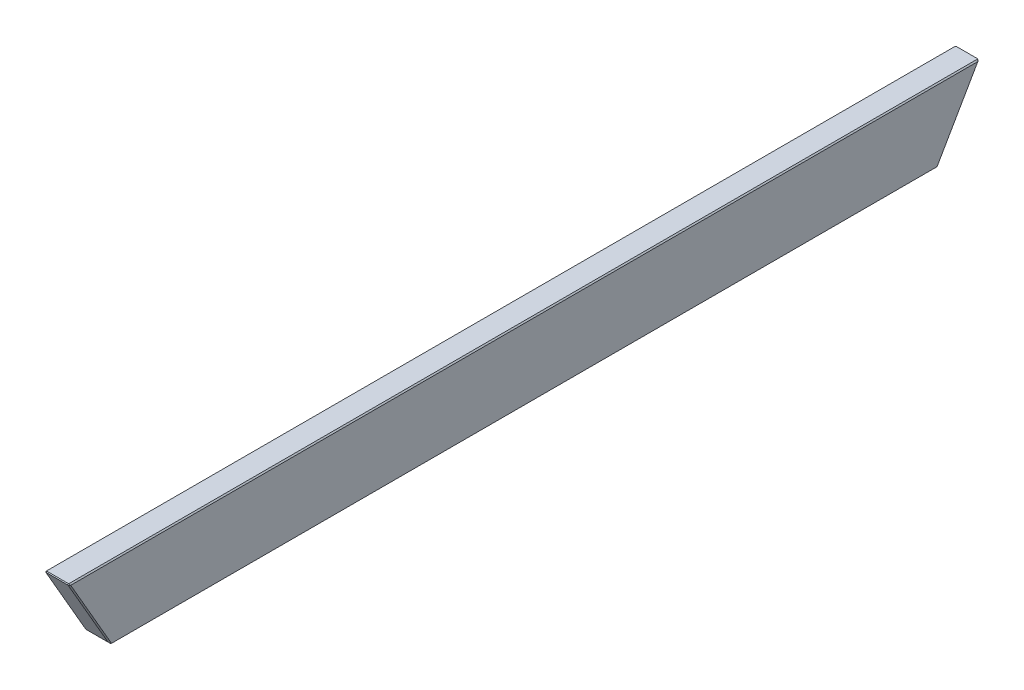
ISO-10303-21;
HEADER;
FILE_DESCRIPTION(('STEP AP214'),'2;1');
FILE_NAME('part.step','',(''),(''),'','','');
FILE_SCHEMA(('AUTOMOTIVE_DESIGN { 1 0 10303 214 1 1 1 1 }'));
ENDSEC;
DATA;
#1=APPLICATION_CONTEXT('core data for automotive mechanical design processes');
#2=APPLICATION_PROTOCOL_DEFINITION('international standard','automotive_design',2000,#1);
#3=PRODUCT_CONTEXT('',#1,'mechanical');
#4=PRODUCT('Part','Part','',(#3));
#5=PRODUCT_RELATED_PRODUCT_CATEGORY('part','',(#4));
#6=PRODUCT_DEFINITION_FORMATION('','',#4);
#7=PRODUCT_DEFINITION_CONTEXT('part definition',#1,'design');
#8=PRODUCT_DEFINITION('design','',#6,#7);
#9=PRODUCT_DEFINITION_SHAPE('','',#8);
#10=(LENGTH_UNIT() NAMED_UNIT(*) SI_UNIT(.MILLI.,.METRE.));
#11=(NAMED_UNIT(*) PLANE_ANGLE_UNIT() SI_UNIT($,.RADIAN.));
#12=(NAMED_UNIT(*) SI_UNIT($,.STERADIAN.) SOLID_ANGLE_UNIT());
#13=UNCERTAINTY_MEASURE_WITH_UNIT(LENGTH_MEASURE(1.E-05),#10,'distance_accuracy_value','');
#14=(GEOMETRIC_REPRESENTATION_CONTEXT(3) GLOBAL_UNCERTAINTY_ASSIGNED_CONTEXT((#13)) GLOBAL_UNIT_ASSIGNED_CONTEXT((#10,
#11,#12)) REPRESENTATION_CONTEXT('',''));
#15=CARTESIAN_POINT('',(0.,0.,0.));
#16=DIRECTION('',(0.,0.,1.));
#17=DIRECTION('',(1.,0.,0.));
#18=AXIS2_PLACEMENT_3D('',#15,#16,#17);
#19=CARTESIAN_POINT('',(1.05,-3.125,39.));
#20=DIRECTION('',(-1.,0.,0.));
#21=DIRECTION('',(0.,0.,1.));
#22=AXIS2_PLACEMENT_3D('',#19,#20,#21);
#23=PLANE('',#22);
#24=DIRECTION('',(0.,0.,-1.));
#25=VECTOR('',#24,1.);
#26=CARTESIAN_POINT('',(1.05,-3.02499999999999,39.));
#27=LINE('',#26,#25);
#28=CARTESIAN_POINT('',(1.05,-3.02499999999999,35.3338257906459));
#29=VERTEX_POINT('',#28);
#30=CARTESIAN_POINT('',(1.05,-3.02499999999999,-35.3338257906459));
#31=VERTEX_POINT('',#30);
#32=EDGE_CURVE('E342',#29,#31,#27,.T.);
#33=ORIENTED_EDGE('',*,*,#32,.T.);
#34=DIRECTION('',(0.,0.866025403784439,-0.5));
#35=VECTOR('',#34,1.);
#36=CARTESIAN_POINT('',(1.05,3.07499999999999,-38.8556624327026));
#37=LINE('',#36,#35);
#38=CARTESIAN_POINT('',(1.05,3.02499999999999,-38.8267949192431));
#39=VERTEX_POINT('',#38);
#40=EDGE_CURVE('E229',#31,#39,#37,.T.);
#41=ORIENTED_EDGE('',*,*,#40,.T.);
#42=DIRECTION('',(0.,0.,1.));
#43=VECTOR('',#42,1.);
#44=CARTESIAN_POINT('',(1.05,3.02499999999999,39.));
#45=LINE('',#44,#43);
#46=CARTESIAN_POINT('',(1.05,3.02499999999999,38.8267949192431));
#47=VERTEX_POINT('',#46);
#48=EDGE_CURVE('E335',#39,#47,#45,.T.);
#49=ORIENTED_EDGE('',*,*,#48,.T.);
#50=DIRECTION('',(0.,-0.866025403784439,-0.5));
#51=VECTOR('',#50,1.);
#52=CARTESIAN_POINT('',(1.05,-1.5125,36.2070680727952));
#53=LINE('',#52,#51);
#54=EDGE_CURVE('E227',#47,#29,#53,.T.);
#55=ORIENTED_EDGE('',*,*,#54,.T.);
#56=EDGE_LOOP('',(#33,#41,#49,#55));
#57=FACE_BOUND('',#56,.T.);
#58=ADVANCED_FACE('F36',(#57),#23,.F.);
#59=CARTESIAN_POINT('',(-1.05,3.125,39.));
#60=DIRECTION('',(0.,-1.,0.));
#61=DIRECTION('',(0.,0.,-1.));
#62=AXIS2_PLACEMENT_3D('',#59,#60,#61);
#63=PLANE('',#62);
#64=DIRECTION('',(0.,0.,-1.));
#65=VECTOR('',#64,1.);
#66=CARTESIAN_POINT('',(0.94999999999999,3.125,39.));
#67=LINE('',#66,#65);
#68=CARTESIAN_POINT('',(0.94999999999999,3.125,38.8919876550265));
#69=VERTEX_POINT('',#68);
#70=CARTESIAN_POINT('',(0.94999999999999,3.125,-38.8919876550265));
#71=VERTEX_POINT('',#70);
#72=EDGE_CURVE('E345',#69,#71,#67,.T.);
#73=ORIENTED_EDGE('',*,*,#72,.T.);
#74=DIRECTION('',(-0.688816127388591,0.,-0.724936095562487));
#75=VECTOR('',#74,1.);
#76=CARTESIAN_POINT('',(0.2271197285449,3.125,-39.6527741417404));
#77=LINE('',#76,#75);
#78=CARTESIAN_POINT('',(0.91692700902958,3.125,-38.9267949192431));
#79=VERTEX_POINT('',#78);
#80=EDGE_CURVE('E249',#71,#79,#77,.T.);
#81=ORIENTED_EDGE('',*,*,#80,.T.);
#82=DIRECTION('',(-1.,0.,0.));
#83=VECTOR('',#82,1.);
#84=CARTESIAN_POINT('',(-0.94999999999999,3.125,-38.9267949192431));
#85=LINE('',#84,#83);
#86=CARTESIAN_POINT('',(-0.916927009029587,3.125,-38.9267949192431));
#87=VERTEX_POINT('',#86);
#88=EDGE_CURVE('E247',#79,#87,#85,.T.);
#89=ORIENTED_EDGE('',*,*,#88,.T.);
#90=DIRECTION('',(-0.688816127388657,0.,0.724936095562425));
#91=VECTOR('',#90,1.);
#92=CARTESIAN_POINT('',(-0.913609282737055,3.125,-38.9302866196389));
#93=LINE('',#92,#91);
#94=CARTESIAN_POINT('',(-0.94999999999999,3.125,-38.8919876550265));
#95=VERTEX_POINT('',#94);
#96=EDGE_CURVE('E245',#87,#95,#93,.T.);
#97=ORIENTED_EDGE('',*,*,#96,.T.);
#98=DIRECTION('',(0.,0.,1.));
#99=VECTOR('',#98,1.);
#100=CARTESIAN_POINT('',(-0.94999999999999,3.125,39.));
#101=LINE('',#100,#99);
#102=CARTESIAN_POINT('',(-0.94999999999999,3.125,38.8919876550265));
#103=VERTEX_POINT('',#102);
#104=EDGE_CURVE('E207',#95,#103,#101,.T.);
#105=ORIENTED_EDGE('',*,*,#104,.T.);
#106=DIRECTION('',(0.688816127388628,0.,0.724936095562452));
#107=VECTOR('',#106,1.);
#108=CARTESIAN_POINT('',(-0.913609282737045,3.125,38.9302866196389));
#109=LINE('',#108,#107);
#110=CARTESIAN_POINT('',(-0.942386870415589,3.125,38.9));
#111=VERTEX_POINT('',#110);
#112=EDGE_CURVE('E243',#103,#111,#109,.T.);
#113=ORIENTED_EDGE('',*,*,#112,.T.);
#114=DIRECTION('',(1.,0.,0.));
#115=VECTOR('',#114,1.);
#116=CARTESIAN_POINT('',(-1.05,3.125,38.9));
#117=LINE('',#116,#115);
#118=CARTESIAN_POINT('',(0.942386870415594,3.125,38.9));
#119=VERTEX_POINT('',#118);
#120=EDGE_CURVE('E241',#111,#119,#117,.T.);
#121=ORIENTED_EDGE('',*,*,#120,.T.);
#122=DIRECTION('',(0.688816127388591,0.,-0.724936095562488));
#123=VECTOR('',#122,1.);
#124=CARTESIAN_POINT('',(0.227119728544901,3.125,39.6527741417404));
#125=LINE('',#124,#123);
#126=EDGE_CURVE('E239',#119,#69,#125,.T.);
#127=ORIENTED_EDGE('',*,*,#126,.T.);
#128=EDGE_LOOP('',(#73,#81,#89,#97,#105,#113,#121,#127));
#129=FACE_BOUND('',#128,.T.);
#130=ADVANCED_FACE('F418',(#129),#63,.F.);
#131=CARTESIAN_POINT('',(-1.05,-3.125,39.));
#132=DIRECTION('',(1.,0.,0.));
#133=DIRECTION('',(0.,0.,-1.));
#134=AXIS2_PLACEMENT_3D('',#131,#132,#133);
#135=PLANE('',#134);
#136=DIRECTION('',(0.,0.,-1.));
#137=VECTOR('',#136,1.);
#138=CARTESIAN_POINT('',(-1.05,3.02499999999999,39.));
#139=LINE('',#138,#137);
#140=CARTESIAN_POINT('',(-1.05,3.02499999999999,38.8267949192431));
#141=VERTEX_POINT('',#140);
#142=CARTESIAN_POINT('',(-1.05,3.02499999999999,-38.8267949192431));
#143=VERTEX_POINT('',#142);
#144=EDGE_CURVE('E348',#141,#143,#139,.T.);
#145=ORIENTED_EDGE('',*,*,#144,.T.);
#146=DIRECTION('',(0.,-0.866025403784439,0.5));
#147=VECTOR('',#146,1.);
#148=CARTESIAN_POINT('',(-1.05,-2.97499999999999,-35.3626933041054));
#149=LINE('',#148,#147);
#150=CARTESIAN_POINT('',(-1.05,-3.02499999999999,-35.3338257906459));
#151=VERTEX_POINT('',#150);
#152=EDGE_CURVE('E262',#143,#151,#149,.T.);
#153=ORIENTED_EDGE('',*,*,#152,.T.);
#154=DIRECTION('',(0.,0.,1.));
#155=VECTOR('',#154,1.);
#156=CARTESIAN_POINT('',(-1.05,-3.02499999999999,39.));
#157=LINE('',#156,#155);
#158=CARTESIAN_POINT('',(-1.05,-3.02499999999999,35.3338257906459));
#159=VERTEX_POINT('',#158);
#160=EDGE_CURVE('E343',#151,#159,#157,.T.);
#161=ORIENTED_EDGE('',*,*,#160,.T.);
#162=DIRECTION('',(0.,0.866025403784439,0.5));
#163=VECTOR('',#162,1.);
#164=CARTESIAN_POINT('',(-1.05,-1.5125,36.2070680727952));
#165=LINE('',#164,#163);
#166=EDGE_CURVE('E260',#159,#141,#165,.T.);
#167=ORIENTED_EDGE('',*,*,#166,.T.);
#168=EDGE_LOOP('',(#145,#153,#161,#167));
#169=FACE_BOUND('',#168,.T.);
#170=ADVANCED_FACE('F392',(#169),#135,.F.);
#171=CARTESIAN_POINT('',(-1.05,-3.125,39.));
#172=DIRECTION('',(0.,1.,0.));
#173=DIRECTION('',(0.,0.,1.));
#174=AXIS2_PLACEMENT_3D('',#171,#172,#173);
#175=PLANE('',#174);
#176=DIRECTION('',(0.,0.,-1.));
#177=VECTOR('',#176,1.);
#178=CARTESIAN_POINT('',(-0.94999999999999,-3.125,39.));
#179=LINE('',#178,#177);
#180=CARTESIAN_POINT('',(-0.94999999999999,-3.125,35.2915608175648));
#181=VERTEX_POINT('',#180);
#182=CARTESIAN_POINT('',(-0.94999999999999,-3.125,-35.1183557368079));
#183=VERTEX_POINT('',#182);
#184=EDGE_CURVE('E383',#181,#183,#179,.T.);
#185=ORIENTED_EDGE('',*,*,#184,.T.);
#186=DIRECTION('',(1.,0.,0.));
#187=VECTOR('',#186,1.);
#188=CARTESIAN_POINT('',(0.94999999999999,-3.125,-35.1183557368079));
#189=LINE('',#188,#187);
#190=CARTESIAN_POINT('',(0.94999999999999,-3.125,-35.1183557368079));
#191=VERTEX_POINT('',#190);
#192=EDGE_CURVE('E276',#183,#191,#189,.T.);
#193=ORIENTED_EDGE('',*,*,#192,.T.);
#194=DIRECTION('',(0.,0.,1.));
#195=VECTOR('',#194,1.);
#196=CARTESIAN_POINT('',(0.94999999999999,-3.125,39.));
#197=LINE('',#196,#195);
#198=CARTESIAN_POINT('',(0.94999999999999,-3.125,35.2915608175648));
#199=VERTEX_POINT('',#198);
#200=EDGE_CURVE('E303',#191,#199,#197,.T.);
#201=ORIENTED_EDGE('',*,*,#200,.T.);
#202=DIRECTION('',(-1.,0.,0.));
#203=VECTOR('',#202,1.);
#204=CARTESIAN_POINT('',(-1.05,-3.125,35.2915608175648));
#205=LINE('',#204,#203);
#206=EDGE_CURVE('E274',#199,#181,#205,.T.);
#207=ORIENTED_EDGE('',*,*,#206,.T.);
#208=EDGE_LOOP('',(#185,#193,#201,#207));
#209=FACE_BOUND('',#208,.T.);
#210=ADVANCED_FACE('F380',(#209),#175,.F.);
#211=CARTESIAN_POINT('',(-1.05,3.125,39.));
#212=DIRECTION('',(0.,-0.5,0.866025403784438));
#213=DIRECTION('',(0.,-0.866025403784439,-0.5));
#214=AXIS2_PLACEMENT_3D('',#211,#212,#213);
#215=PLANE('',#214);
#216=DIRECTION('',(1.,0.,0.));
#217=VECTOR('',#216,1.);
#218=CARTESIAN_POINT('',(-1.05,3.06160254037843,38.9633974596215));
#219=LINE('',#218,#217);
#220=CARTESIAN_POINT('',(0.910766833790927,3.06160254037843,38.9633974596215));
#221=VERTEX_POINT('',#220);
#222=CARTESIAN_POINT('',(-0.910766833790914,3.06160254037843,38.9633974596215));
#223=VERTEX_POINT('',#222);
#224=EDGE_CURVE('E46',#221,#223,#219,.F.);
#225=ORIENTED_EDGE('',*,*,#224,.T.);
#226=DIRECTION('',(0.654653670707977,0.654653670707977,0.377964473009228));
#227=VECTOR('',#226,1.);
#228=CARTESIAN_POINT('',(-0.991353928096774,2.98101544607257,38.9168704790308));
#229=LINE('',#228,#227);
#230=CARTESIAN_POINT('',(-0.949999999999998,3.02236937416935,38.9407461805496));
#231=VERTEX_POINT('',#230);
#232=EDGE_CURVE('E11',#223,#231,#229,.F.);
#233=ORIENTED_EDGE('',*,*,#232,.T.);
#234=DIRECTION('',(0.,0.866025403784439,0.5));
#235=VECTOR('',#234,1.);
#236=CARTESIAN_POINT('',(-0.949999999999998,3.125,39.));
#237=LINE('',#236,#235);
#238=CARTESIAN_POINT('',(-0.949999999999998,-2.88839745962157,35.5281633579433));
#239=VERTEX_POINT('',#238);
#240=EDGE_CURVE('E278',#231,#239,#237,.F.);
#241=ORIENTED_EDGE('',*,*,#240,.T.);
#242=DIRECTION('',(-1.,0.,0.));
#243=VECTOR('',#242,1.);
#244=CARTESIAN_POINT('',(-1.05,-2.88839745962157,35.5281633579433));
#245=LINE('',#244,#243);
#246=CARTESIAN_POINT('',(0.949999999999997,-2.88839745962157,35.5281633579433));
#247=VERTEX_POINT('',#246);
#248=EDGE_CURVE('E280',#239,#247,#245,.F.);
#249=ORIENTED_EDGE('',*,*,#248,.T.);
#250=DIRECTION('',(0.,-0.866025403784439,-0.5));
#251=VECTOR('',#250,1.);
#252=CARTESIAN_POINT('',(0.949999999999997,3.125,39.));
#253=LINE('',#252,#251);
#254=CARTESIAN_POINT('',(0.949999999999997,3.02236937416936,38.9407461805496));
#255=VERTEX_POINT('',#254);
#256=EDGE_CURVE('E282',#247,#255,#253,.F.);
#257=ORIENTED_EDGE('',*,*,#256,.T.);
#258=DIRECTION('',(0.654653670707977,-0.654653670707977,-0.377964473009228));
#259=VECTOR('',#258,1.);
#260=CARTESIAN_POINT('',(0.891353928096772,3.08101544607258,38.9746055059498));
#261=LINE('',#260,#259);
#262=EDGE_CURVE('E57',#255,#221,#261,.F.);
#263=ORIENTED_EDGE('',*,*,#262,.T.);
#264=EDGE_LOOP('',(#225,#233,#241,#249,#257,#263));
#265=FACE_BOUND('',#264,.T.);
#266=ADVANCED_FACE('F450',(#265),#215,.T.);
#267=CARTESIAN_POINT('',(-1.05,3.125,-39.));
#268=DIRECTION('',(0.,-0.5,-0.866025403784438));
#269=DIRECTION('',(0.,0.866025403784439,-0.5));
#270=AXIS2_PLACEMENT_3D('',#267,#268,#269);
#271=PLANE('',#270);
#272=DIRECTION('',(0.,-0.866025403784439,0.5));
#273=VECTOR('',#272,1.);
#274=CARTESIAN_POINT('',(0.949999999999993,-3.02499999999999,-35.4492958444838));
#275=LINE('',#274,#273);
#276=CARTESIAN_POINT('',(0.949999999999994,3.02236937416936,-38.9407461805496));
#277=VERTEX_POINT('',#276);
#278=CARTESIAN_POINT('',(0.949999999999993,-2.89764746127689,-35.5228228669976));
#279=VERTEX_POINT('',#278);
#280=EDGE_CURVE('E211',#277,#279,#275,.T.);
#281=ORIENTED_EDGE('',*,*,#280,.T.);
#282=DIRECTION('',(-0.654653670707977,-0.654653670707977,0.377964473009228));
#283=VECTOR('',#282,1.);
#284=CARTESIAN_POINT('',(3.5343699778725,-0.313277483404376,-37.0149095694079));
#285=LINE('',#284,#283);
#286=CARTESIAN_POINT('',(0.809250001655327,-3.03839745962155,-35.4415608175648));
#287=VERTEX_POINT('',#286);
#288=EDGE_CURVE('E191',#279,#287,#285,.T.);
#289=ORIENTED_EDGE('',*,*,#288,.T.);
#290=DIRECTION('',(-1.,0.,0.));
#291=VECTOR('',#290,1.);
#292=CARTESIAN_POINT('',(-0.94999999999999,-3.03839745962155,-35.4415608175648));
#293=LINE('',#292,#291);
#294=CARTESIAN_POINT('',(-0.809250001655315,-3.03839745962155,-35.4415608175648));
#295=VERTEX_POINT('',#294);
#296=EDGE_CURVE('E199',#287,#295,#293,.T.);
#297=ORIENTED_EDGE('',*,*,#296,.T.);
#298=DIRECTION('',(-0.654653670707977,0.654653670707977,-0.377964473009228));
#299=VECTOR('',#298,1.);
#300=CARTESIAN_POINT('',(-4.4343699778725,0.58672251659563,-37.5345248116785));
#301=LINE('',#300,#299);
#302=CARTESIAN_POINT('',(-0.949999999999988,-2.89764746127688,-35.5228228669976));
#303=VERTEX_POINT('',#302);
#304=EDGE_CURVE('E206',#295,#303,#301,.T.);
#305=ORIENTED_EDGE('',*,*,#304,.T.);
#306=DIRECTION('',(0.,0.866025403784439,-0.5));
#307=VECTOR('',#306,1.);
#308=CARTESIAN_POINT('',(-0.94999999999999,3.02499999999999,-38.942264973081));
#309=LINE('',#308,#307);
#310=CARTESIAN_POINT('',(-0.94999999999999,3.02236937416936,-38.9407461805496));
#311=VERTEX_POINT('',#310);
#312=EDGE_CURVE('E357',#303,#311,#309,.T.);
#313=ORIENTED_EDGE('',*,*,#312,.T.);
#314=DIRECTION('',(0.654653670707977,0.654653670707977,-0.377964473009228));
#315=VECTOR('',#314,1.);
#316=CARTESIAN_POINT('',(-0.934211070953914,3.03815830321544,-38.9498619229845));
#317=LINE('',#316,#315);
#318=CARTESIAN_POINT('',(-0.933971914547795,3.03839745962155,-38.95));
#319=VERTEX_POINT('',#318);
#320=EDGE_CURVE('E359',#311,#319,#317,.T.);
#321=ORIENTED_EDGE('',*,*,#320,.T.);
#322=DIRECTION('',(1.,0.,0.));
#323=VECTOR('',#322,1.);
#324=CARTESIAN_POINT('',(0.94999999999999,3.03839745962156,-38.95));
#325=LINE('',#324,#323);
#326=CARTESIAN_POINT('',(0.933971914547802,3.03839745962155,-38.95));
#327=VERTEX_POINT('',#326);
#328=EDGE_CURVE('E361',#319,#327,#325,.T.);
#329=ORIENTED_EDGE('',*,*,#328,.T.);
#330=DIRECTION('',(0.654653670707977,-0.654653670707977,0.377964473009228));
#331=VECTOR('',#330,1.);
#332=CARTESIAN_POINT('',(0.034211070953918,3.93815830321544,-39.4694771652552));
#333=LINE('',#332,#331);
#334=EDGE_CURVE('E217',#327,#277,#333,.T.);
#335=ORIENTED_EDGE('',*,*,#334,.T.);
#336=EDGE_LOOP('',(#281,#289,#297,#305,#313,#321,#329,#335));
#337=FACE_BOUND('',#336,.T.);
#338=ADVANCED_FACE('F209',(#337),#271,.T.);
#339=CARTESIAN_POINT('',(-0.94999999999999,-3.125,39.));
#340=DIRECTION('',(0.707106781186548,0.707106781186548,0.));
#341=DIRECTION('',(0.,0.,-1.));
#342=AXIS2_PLACEMENT_3D('',#339,#340,#341);
#343=PLANE('',#342);
#344=ORIENTED_EDGE('',*,*,#160,.F.);
#345=DIRECTION('',(-0.654653670707984,0.654653670707984,0.377964473009204));
#346=VECTOR('',#345,1.);
#347=CARTESIAN_POINT('',(-19.3571375700523,15.2821375700523,-24.7641949864854));
#348=LINE('',#347,#346);
#349=CARTESIAN_POINT('',(-1.04354143466935,-3.03145856533063,-35.3375546450781));
#350=VERTEX_POINT('',#349);
#351=EDGE_CURVE('E272',#151,#350,#348,.F.);
#352=ORIENTED_EDGE('',*,*,#351,.T.);
#353=DIRECTION('',(-0.654653670707977,0.654653670707977,-0.377964473009227));
#354=VECTOR('',#353,1.);
#355=CARTESIAN_POINT('',(17.430411445862,-21.505411445862,-24.6716129765069));
#356=LINE('',#355,#354);
#357=CARTESIAN_POINT('',(-1.00236399898302,-3.07263600101697,-35.3137808415001));
#358=VERTEX_POINT('',#357);
#359=EDGE_CURVE('E270',#350,#358,#356,.F.);
#360=ORIENTED_EDGE('',*,*,#359,.T.);
#361=DIRECTION('',(-0.250562807085729,0.250562807085729,-0.935113126531031));
#362=VECTOR('',#361,1.);
#363=CARTESIAN_POINT('',(16.4162694645594,-20.4912694645594,29.6934442428602));
#364=LINE('',#363,#362);
#365=EDGE_CURVE('E268',#358,#183,#364,.F.);
#366=ORIENTED_EDGE('',*,*,#365,.T.);
#367=ORIENTED_EDGE('',*,*,#184,.F.);
#368=DIRECTION('',(0.577350269189626,-0.577350269189626,-0.577350269189626));
#369=VECTOR('',#368,1.);
#370=CARTESIAN_POINT('',(-2.18614639414504,-1.88885360585495,36.5277072117099));
#371=LINE('',#370,#369);
#372=CARTESIAN_POINT('',(-1.01339745962155,-3.06160254037844,35.3549582771864));
#373=VERTEX_POINT('',#372);
#374=EDGE_CURVE('E266',#181,#373,#371,.F.);
#375=ORIENTED_EDGE('',*,*,#374,.T.);
#376=DIRECTION('',(0.654653670707976,-0.654653670707976,0.377964473009233));
#377=VECTOR('',#376,1.);
#378=CARTESIAN_POINT('',(-0.0571428571428382,-4.01785714285715,35.9070521293413));
#379=LINE('',#378,#377);
#380=EDGE_CURVE('E264',#373,#159,#379,.F.);
#381=ORIENTED_EDGE('',*,*,#380,.T.);
#382=EDGE_LOOP('',(#344,#352,#360,#366,#367,#375,#381));
#383=FACE_BOUND('',#382,.T.);
#384=ADVANCED_FACE('F404',(#383),#343,.F.);
#385=CARTESIAN_POINT('',(1.05,-3.02499999999999,39.));
#386=DIRECTION('',(-0.707106781186548,0.707106781186548,0.));
#387=DIRECTION('',(0.,0.,-1.));
#388=AXIS2_PLACEMENT_3D('',#385,#386,#387);
#389=PLANE('',#388);
#390=DIRECTION('',(-0.654653670707977,-0.654653670707977,0.377964473009227));
#391=VECTOR('',#390,1.);
#392=CARTESIAN_POINT('',(-17.3446971601477,-21.4196971601477,-24.7211001424374));
#393=LINE('',#392,#391);
#394=CARTESIAN_POINT('',(1.00236399898301,-3.07263600101697,-35.3137808415));
#395=VERTEX_POINT('',#394);
#396=CARTESIAN_POINT('',(1.04354143466936,-3.03145856533063,-35.3375546450781));
#397=VERTEX_POINT('',#396);
#398=EDGE_CURVE('E193',#395,#397,#393,.F.);
#399=ORIENTED_EDGE('',*,*,#398,.T.);
#400=DIRECTION('',(-0.654653670707984,-0.654653670707984,-0.377964473009204));
#401=VECTOR('',#400,1.);
#402=CARTESIAN_POINT('',(19.4428518557666,15.3678518557666,-24.7147078205549));
#403=LINE('',#402,#401);
#404=EDGE_CURVE('E225',#397,#31,#403,.F.);
#405=ORIENTED_EDGE('',*,*,#404,.T.);
#406=ORIENTED_EDGE('',*,*,#32,.F.);
#407=DIRECTION('',(0.654653670707976,0.654653670707976,-0.377964473009233));
#408=VECTOR('',#407,1.);
#409=CARTESIAN_POINT('',(0.142857142857132,-3.93214285714286,35.8575649634108));
#410=LINE('',#409,#408);
#411=CARTESIAN_POINT('',(1.01339745962155,-3.06160254037844,35.3549582771864));
#412=VERTEX_POINT('',#411);
#413=EDGE_CURVE('E215',#29,#412,#410,.F.);
#414=ORIENTED_EDGE('',*,*,#413,.T.);
#415=DIRECTION('',(0.577350269189626,0.577350269189626,0.577350269189626));
#416=VECTOR('',#415,1.);
#417=CARTESIAN_POINT('',(2.25281306081172,-1.82218693918827,36.5943738783766));
#418=LINE('',#417,#416);
#419=EDGE_CURVE('E213',#412,#199,#418,.F.);
#420=ORIENTED_EDGE('',*,*,#419,.T.);
#421=ORIENTED_EDGE('',*,*,#200,.F.);
#422=DIRECTION('',(-0.250562807085729,-0.250562807085729,0.935113126531031));
#423=VECTOR('',#422,1.);
#424=CARTESIAN_POINT('',(-16.4037131205004,-20.4787131205004,29.6465833288749));
#425=LINE('',#424,#423);
#426=EDGE_CURVE('E222',#191,#395,#425,.F.);
#427=ORIENTED_EDGE('',*,*,#426,.T.);
#428=EDGE_LOOP('',(#399,#405,#406,#414,#420,#421,#427));
#429=FACE_BOUND('',#428,.T.);
#430=ADVANCED_FACE('F374',(#429),#389,.F.);
#431=CARTESIAN_POINT('',(-1.05,3.02499999999999,39.));
#432=DIRECTION('',(0.707106781186548,-0.707106781186548,0.));
#433=DIRECTION('',(0.,0.,-1.));
#434=AXIS2_PLACEMENT_3D('',#431,#432,#433);
#435=PLANE('',#434);
#436=ORIENTED_EDGE('',*,*,#104,.F.);
#437=DIRECTION('',(0.654653670707977,0.654653670707977,-0.377964473009227));
#438=VECTOR('',#437,1.);
#439=CARTESIAN_POINT('',(-20.3089828744334,-16.2339828744334,-27.715073681235));
#440=LINE('',#439,#438);
#441=CARTESIAN_POINT('',(-1.04354143466934,3.03145856533065,-38.8379814825398));
#442=VERTEX_POINT('',#441);
#443=EDGE_CURVE('E258',#95,#442,#440,.F.);
#444=ORIENTED_EDGE('',*,*,#443,.T.);
#445=DIRECTION('',(0.447213595499964,0.447213595499964,-0.774596669241476));
#446=VECTOR('',#445,1.);
#447=CARTESIAN_POINT('',(-28.0099925980746,-23.9349925980746,7.8692820323019));
#448=LINE('',#447,#446);
#449=EDGE_CURVE('E256',#442,#143,#448,.F.);
#450=ORIENTED_EDGE('',*,*,#449,.T.);
#451=ORIENTED_EDGE('',*,*,#144,.F.);
#452=DIRECTION('',(-0.447213595499956,-0.447213595499956,-0.774596669241485));
#453=VECTOR('',#452,1.);
#454=CARTESIAN_POINT('',(-0.989999999999997,3.08499999999999,38.9307179676972));
#455=LINE('',#454,#453);
#456=CARTESIAN_POINT('',(-1.04354143466937,3.03145856533063,38.8379814825398));
#457=VERTEX_POINT('',#456);
#458=EDGE_CURVE('E251',#141,#457,#455,.F.);
#459=ORIENTED_EDGE('',*,*,#458,.T.);
#460=DIRECTION('',(-0.654653670707977,-0.654653670707977,-0.377964473009227));
#461=VECTOR('',#460,1.);
#462=CARTESIAN_POINT('',(-0.923273875808743,3.15172612419125,38.9074179900227));
#463=LINE('',#462,#461);
#464=EDGE_CURVE('E253',#457,#103,#463,.F.);
#465=ORIENTED_EDGE('',*,*,#464,.T.);
#466=EDGE_LOOP('',(#436,#444,#450,#451,#459,#465));
#467=FACE_BOUND('',#466,.T.);
#468=ADVANCED_FACE('F412',(#467),#435,.F.);
#469=CARTESIAN_POINT('',(0.94999999999999,3.125,39.));
#470=DIRECTION('',(-0.707106781186548,-0.707106781186548,0.));
#471=DIRECTION('',(0.,0.,-1.));
#472=AXIS2_PLACEMENT_3D('',#469,#470,#471);
#473=PLANE('',#472);
#474=ORIENTED_EDGE('',*,*,#48,.F.);
#475=DIRECTION('',(0.447213595499964,-0.447213595499964,0.774596669241476));
#476=VECTOR('',#475,1.);
#477=CARTESIAN_POINT('',(27.9699925980746,-23.8949925980746,7.79999999999913));
#478=LINE('',#477,#476);
#479=CARTESIAN_POINT('',(1.04354143466936,3.03145856533063,-38.8379814825398));
#480=VERTEX_POINT('',#479);
#481=EDGE_CURVE('E237',#39,#480,#478,.F.);
#482=ORIENTED_EDGE('',*,*,#481,.T.);
#483=DIRECTION('',(0.654653670707977,-0.654653670707977,0.377964473009227));
#484=VECTOR('',#483,1.);
#485=CARTESIAN_POINT('',(20.2232685887191,-16.1482685887191,-27.7645608471656));
#486=LINE('',#485,#484);
#487=EDGE_CURVE('E235',#480,#71,#486,.F.);
#488=ORIENTED_EDGE('',*,*,#487,.T.);
#489=ORIENTED_EDGE('',*,*,#72,.F.);
#490=DIRECTION('',(-0.654653670707977,0.654653670707977,0.377964473009227));
#491=VECTOR('',#490,1.);
#492=CARTESIAN_POINT('',(1.02327387580875,3.05172612419124,38.8496829631038));
#493=LINE('',#492,#491);
#494=CARTESIAN_POINT('',(1.04354143466936,3.03145856533063,38.8379814825398));
#495=VERTEX_POINT('',#494);
#496=EDGE_CURVE('E233',#69,#495,#493,.F.);
#497=ORIENTED_EDGE('',*,*,#496,.T.);
#498=DIRECTION('',(-0.447213595499956,0.447213595499956,0.774596669241485));
#499=VECTOR('',#498,1.);
#500=CARTESIAN_POINT('',(0.94999999999999,3.125,39.));
#501=LINE('',#500,#499);
#502=EDGE_CURVE('E231',#495,#47,#501,.F.);
#503=ORIENTED_EDGE('',*,*,#502,.T.);
#504=EDGE_LOOP('',(#474,#482,#488,#489,#497,#503));
#505=FACE_BOUND('',#504,.T.);
#506=ADVANCED_FACE('F334',(#505),#473,.F.);
#507=CARTESIAN_POINT('',(-0.934211070953916,3.03815830321544,-38.9498619229845));
#508=DIRECTION('',(-0.688982236504597,0.311017763495358,-0.654653670708008));
#509=DIRECTION('',(-0.654653670707977,-0.654653670707977,0.377964473009227));
#510=AXIS2_PLACEMENT_3D('',#507,#508,#509);
#511=PLANE('',#510);
#512=ORIENTED_EDGE('',*,*,#443,.F.);
#513=ORIENTED_EDGE('',*,*,#96,.F.);
#514=DIRECTION('',(-0.186766099053724,-0.948929791212218,-0.254264971229208));
#515=VECTOR('',#514,1.);
#516=CARTESIAN_POINT('',(-0.934016084879484,3.03817303696755,-38.9500601338689));
#517=LINE('',#516,#515);
#518=EDGE_CURVE('E300',#319,#87,#517,.F.);
#519=ORIENTED_EDGE('',*,*,#518,.F.);
#520=ORIENTED_EDGE('',*,*,#320,.F.);
#521=DIRECTION('',(0.671706153596172,-0.0652680350245567,-0.737936939599224));
#522=VECTOR('',#521,1.);
#523=CARTESIAN_POINT('',(-10.3362966528514,3.93441273629923,-28.6289528627534));
#524=LINE('',#523,#522);
#525=EDGE_CURVE('E297',#442,#311,#524,.T.);
#526=ORIENTED_EDGE('',*,*,#525,.F.);
#527=EDGE_LOOP('',(#512,#513,#519,#520,#526));
#528=FACE_BOUND('',#527,.T.);
#529=ADVANCED_FACE('F428',(#528),#511,.T.);
#530=CARTESIAN_POINT('',(-1.05,3.125,-38.9267949192431));
#531=DIRECTION('',(0.,0.258819045102578,-0.965925826289053));
#532=DIRECTION('',(1.,0.,0.));
#533=AXIS2_PLACEMENT_3D('',#530,#531,#532);
#534=PLANE('',#533);
#535=ORIENTED_EDGE('',*,*,#518,.T.);
#536=ORIENTED_EDGE('',*,*,#88,.F.);
#537=DIRECTION('',(0.186766099053849,-0.948929791212196,-0.254264971229202));
#538=VECTOR('',#537,1.);
#539=CARTESIAN_POINT('',(0.848317495558002,3.47359437351628,-38.8333893383734));
#540=LINE('',#539,#538);
#541=EDGE_CURVE('E294',#327,#79,#540,.F.);
#542=ORIENTED_EDGE('',*,*,#541,.F.);
#543=ORIENTED_EDGE('',*,*,#328,.F.);
#544=EDGE_LOOP('',(#535,#536,#542,#543));
#545=FACE_BOUND('',#544,.T.);
#546=ADVANCED_FACE('F423',(#545),#534,.T.);
#547=CARTESIAN_POINT('',(-1.05,-35.2874907475931,-16.7070680727952));
#548=DIRECTION('',(-0.707106781186535,-0.35355339059328,-0.612372435695805));
#549=DIRECTION('',(0.,0.866025403784439,-0.5));
#550=AXIS2_PLACEMENT_3D('',#547,#548,#549);
#551=PLANE('',#550);
#552=ORIENTED_EDGE('',*,*,#525,.T.);
#553=ORIENTED_EDGE('',*,*,#312,.F.);
#554=DIRECTION('',(0.378801154138506,0.541875382083665,-0.750253794335635));
#555=VECTOR('',#554,1.);
#556=CARTESIAN_POINT('',(-0.163041374620199,-1.77190245983532,-37.0814735950269));
#557=LINE('',#556,#555);
#558=EDGE_CURVE('E291',#350,#303,#557,.T.);
#559=ORIENTED_EDGE('',*,*,#558,.F.);
#560=ORIENTED_EDGE('',*,*,#351,.F.);
#561=ORIENTED_EDGE('',*,*,#152,.F.);
#562=ORIENTED_EDGE('',*,*,#449,.F.);
#563=EDGE_LOOP('',(#552,#553,#559,#560,#561,#562));
#564=FACE_BOUND('',#563,.T.);
#565=ADVANCED_FACE('F400',(#564),#551,.T.);
#566=CARTESIAN_POINT('',(0.0342110709539165,3.93815830321544,-39.4694771652552));
#567=DIRECTION('',(0.688982236504638,0.311017763495438,-0.654653670707927));
#568=DIRECTION('',(-0.654653670707977,0.654653670707977,-0.377964473009227));
#569=AXIS2_PLACEMENT_3D('',#566,#567,#568);
#570=PLANE('',#569);
#571=ORIENTED_EDGE('',*,*,#80,.F.);
#572=ORIENTED_EDGE('',*,*,#487,.F.);
#573=DIRECTION('',(-0.67170615359614,-0.0652680350244195,-0.737936939599265));
#574=VECTOR('',#573,1.);
#575=CARTESIAN_POINT('',(0.314875339775164,2.96065587289132,-39.6384946610736));
#576=LINE('',#575,#574);
#577=EDGE_CURVE('E288',#277,#480,#576,.F.);
#578=ORIENTED_EDGE('',*,*,#577,.F.);
#579=ORIENTED_EDGE('',*,*,#334,.F.);
#580=ORIENTED_EDGE('',*,*,#541,.T.);
#581=EDGE_LOOP('',(#571,#572,#578,#579,#580));
#582=FACE_BOUND('',#581,.T.);
#583=ADVANCED_FACE('F369',(#582),#570,.T.);
#584=CARTESIAN_POINT('',(-4.43436997787252,0.586722516595609,-37.5345248116785));
#585=DIRECTION('',(-0.311017763495373,-0.688982236504611,-0.654653670707986));
#586=DIRECTION('',(0.654653670707977,-0.654653670707977,0.377964473009227));
#587=AXIS2_PLACEMENT_3D('',#584,#585,#586);
#588=PLANE('',#587);
#589=ORIENTED_EDGE('',*,*,#558,.T.);
#590=ORIENTED_EDGE('',*,*,#304,.F.);
#591=DIRECTION('',(0.824994684922207,0.146269121149119,-0.545883791706965));
#592=VECTOR('',#591,1.);
#593=CARTESIAN_POINT('',(-1.12911459913139,-3.09510850808601,-35.229912303345));
#594=LINE('',#593,#592);
#595=EDGE_CURVE('E203',#358,#295,#594,.T.);
#596=ORIENTED_EDGE('',*,*,#595,.F.);
#597=ORIENTED_EDGE('',*,*,#359,.F.);
#598=EDGE_LOOP('',(#589,#590,#596,#597));
#599=FACE_BOUND('',#598,.T.);
#600=ADVANCED_FACE('F432',(#599),#588,.T.);
#601=CARTESIAN_POINT('',(1.05,-35.2874907475931,-16.7070680727952));
#602=DIRECTION('',(0.707106781186535,-0.35355339059328,-0.612372435695805));
#603=DIRECTION('',(0.,-0.866025403784439,0.5));
#604=AXIS2_PLACEMENT_3D('',#601,#602,#603);
#605=PLANE('',#604);
#606=ORIENTED_EDGE('',*,*,#40,.F.);
#607=ORIENTED_EDGE('',*,*,#404,.F.);
#608=DIRECTION('',(-0.37880115413854,0.541875382083622,-0.750253794335649));
#609=VECTOR('',#608,1.);
#610=CARTESIAN_POINT('',(12.9601672112986,-20.0782021544404,-11.7354784451616));
#611=LINE('',#610,#609);
#612=EDGE_CURVE('E196',#279,#397,#611,.F.);
#613=ORIENTED_EDGE('',*,*,#612,.F.);
#614=ORIENTED_EDGE('',*,*,#280,.F.);
#615=ORIENTED_EDGE('',*,*,#577,.T.);
#616=ORIENTED_EDGE('',*,*,#481,.F.);
#617=EDGE_LOOP('',(#606,#607,#613,#614,#615,#616));
#618=FACE_BOUND('',#617,.T.);
#619=ADVANCED_FACE('F371',(#618),#605,.T.);
#620=CARTESIAN_POINT('',(-1.05,-3.125,-35.1183557368079));
#621=DIRECTION('',(0.,-0.965925826289069,-0.258819045102518));
#622=DIRECTION('',(-1.,0.,0.));
#623=AXIS2_PLACEMENT_3D('',#620,#621,#622);
#624=PLANE('',#623);
#625=ORIENTED_EDGE('',*,*,#595,.T.);
#626=ORIENTED_EDGE('',*,*,#296,.F.);
#627=DIRECTION('',(0.824994684922176,-0.146269121149131,0.545883791707008));
#628=VECTOR('',#627,1.);
#629=CARTESIAN_POINT('',(-0.300179484183273,-2.84169888830185,-36.1756498795062));
#630=LINE('',#629,#628);
#631=EDGE_CURVE('E187',#395,#287,#630,.F.);
#632=ORIENTED_EDGE('',*,*,#631,.F.);
#633=ORIENTED_EDGE('',*,*,#426,.F.);
#634=ORIENTED_EDGE('',*,*,#192,.F.);
#635=ORIENTED_EDGE('',*,*,#365,.F.);
#636=EDGE_LOOP('',(#625,#626,#632,#633,#634,#635));
#637=FACE_BOUND('',#636,.T.);
#638=ADVANCED_FACE('F200',(#637),#624,.T.);
#639=CARTESIAN_POINT('',(3.53436997787252,-0.313277483404391,-37.0149095694078));
#640=DIRECTION('',(0.311017763495394,-0.68898223650462,-0.654653670707966));
#641=DIRECTION('',(0.654653670707977,0.654653670707977,-0.377964473009227));
#642=AXIS2_PLACEMENT_3D('',#639,#640,#641);
#643=PLANE('',#642);
#644=ORIENTED_EDGE('',*,*,#612,.T.);
#645=ORIENTED_EDGE('',*,*,#398,.F.);
#646=ORIENTED_EDGE('',*,*,#631,.T.);
#647=ORIENTED_EDGE('',*,*,#288,.F.);
#648=EDGE_LOOP('',(#644,#645,#646,#647));
#649=FACE_BOUND('',#648,.T.);
#650=ADVANCED_FACE('F189',(#649),#643,.T.);
#651=CARTESIAN_POINT('',(0.949999999999997,3.125,39.));
#652=DIRECTION('',(0.70710678118655,-0.353553390593272,0.612372435695792));
#653=DIRECTION('',(0.,-0.866025403784439,-0.5));
#654=AXIS2_PLACEMENT_3D('',#651,#652,#653);
#655=PLANE('',#654);
#656=ORIENTED_EDGE('',*,*,#54,.F.);
#657=ORIENTED_EDGE('',*,*,#502,.F.);
#658=DIRECTION('',(-0.671706153596131,-0.0652680350244496,0.737936939599271));
#659=VECTOR('',#658,1.);
#660=CARTESIAN_POINT('',(0.925128680563992,3.01995268922556,38.9680698327897));
#661=LINE('',#660,#659);
#662=EDGE_CURVE('E41',#255,#495,#661,.F.);
#663=ORIENTED_EDGE('',*,*,#662,.F.);
#664=ORIENTED_EDGE('',*,*,#256,.F.);
#665=DIRECTION('',(-0.250562807085729,0.684550319445298,0.684550319445298));
#666=VECTOR('',#665,1.);
#667=CARTESIAN_POINT('',(0.82443655941064,-2.54535176035828,35.8712090572066));
#668=LINE('',#667,#666);
#669=EDGE_CURVE('E314',#412,#247,#668,.T.);
#670=ORIENTED_EDGE('',*,*,#669,.F.);
#671=ORIENTED_EDGE('',*,*,#413,.F.);
#672=EDGE_LOOP('',(#656,#657,#663,#664,#670,#671));
#673=FACE_BOUND('',#672,.T.);
#674=ADVANCED_FACE('F39',(#673),#655,.T.);
#675=CARTESIAN_POINT('',(0.0342110709539165,3.93815830321544,39.4694771652552));
#676=DIRECTION('',(0.688982236504638,0.311017763495439,0.654653670707926));
#677=DIRECTION('',(0.654653670707977,-0.654653670707977,-0.377964473009227));
#678=AXIS2_PLACEMENT_3D('',#675,#676,#677);
#679=PLANE('',#678);
#680=ORIENTED_EDGE('',*,*,#496,.F.);
#681=ORIENTED_EDGE('',*,*,#126,.F.);
#682=DIRECTION('',(-0.332597463362812,-0.666850405775058,0.666850405774985));
#683=VECTOR('',#682,1.);
#684=CARTESIAN_POINT('',(0.895970199878296,3.03193562341226,38.9930643765877));
#685=LINE('',#684,#683);
#686=EDGE_CURVE('E312',#221,#119,#685,.F.);
#687=ORIENTED_EDGE('',*,*,#686,.F.);
#688=ORIENTED_EDGE('',*,*,#262,.F.);
#689=ORIENTED_EDGE('',*,*,#662,.T.);
#690=EDGE_LOOP('',(#680,#681,#687,#688,#689));
#691=FACE_BOUND('',#690,.T.);
#692=ADVANCED_FACE('F324',(#691),#679,.T.);
#693=CARTESIAN_POINT('',(-1.05,-2.88839745962158,35.5281633579433));
#694=DIRECTION('',(0.,-0.707106781186548,0.707106781186548));
#695=DIRECTION('',(-1.,0.,0.));
#696=AXIS2_PLACEMENT_3D('',#693,#694,#695);
#697=PLANE('',#696);
#698=ORIENTED_EDGE('',*,*,#669,.T.);
#699=ORIENTED_EDGE('',*,*,#248,.F.);
#700=DIRECTION('',(0.250562807085729,0.684550319445298,0.684550319445298));
#701=VECTOR('',#700,1.);
#702=CARTESIAN_POINT('',(0.676934382543136,1.55646993406701,39.9730307516319));
#703=LINE('',#702,#701);
#704=EDGE_CURVE('E309',#373,#239,#703,.T.);
#705=ORIENTED_EDGE('',*,*,#704,.F.);
#706=ORIENTED_EDGE('',*,*,#374,.F.);
#707=ORIENTED_EDGE('',*,*,#206,.F.);
#708=ORIENTED_EDGE('',*,*,#419,.F.);
#709=EDGE_LOOP('',(#698,#699,#705,#706,#707,#708));
#710=FACE_BOUND('',#709,.T.);
#711=ADVANCED_FACE('F522',(#710),#697,.T.);
#712=CARTESIAN_POINT('',(-1.05,3.06160254037843,38.9633974596215));
#713=DIRECTION('',(0.,0.707106781186509,0.707106781186586));
#714=DIRECTION('',(1.,0.,0.));
#715=AXIS2_PLACEMENT_3D('',#712,#713,#714);
#716=PLANE('',#715);
#717=ORIENTED_EDGE('',*,*,#686,.T.);
#718=ORIENTED_EDGE('',*,*,#120,.F.);
#719=DIRECTION('',(0.332597463362904,-0.666850405775036,0.666850405774963));
#720=VECTOR('',#719,1.);
#721=CARTESIAN_POINT('',(-0.926168955983392,3.092483447677,38.932516552323));
#722=LINE('',#721,#720);
#723=EDGE_CURVE('E306',#223,#111,#722,.F.);
#724=ORIENTED_EDGE('',*,*,#723,.F.);
#725=ORIENTED_EDGE('',*,*,#224,.F.);
#726=EDGE_LOOP('',(#717,#718,#724,#725));
#727=FACE_BOUND('',#726,.T.);
#728=ADVANCED_FACE('F420',(#727),#716,.T.);
#729=CARTESIAN_POINT('',(-0.949999999999997,3.125,39.));
#730=DIRECTION('',(-0.70710678118655,-0.353553390593272,0.612372435695792));
#731=DIRECTION('',(0.,0.866025403784439,0.5));
#732=AXIS2_PLACEMENT_3D('',#729,#730,#731);
#733=PLANE('',#732);
#734=ORIENTED_EDGE('',*,*,#704,.T.);
#735=ORIENTED_EDGE('',*,*,#240,.F.);
#736=DIRECTION('',(-0.671706153596149,0.0652680350245276,-0.737936939599247));
#737=VECTOR('',#736,1.);
#738=CARTESIAN_POINT('',(-0.925128680563994,3.01995268922554,38.9680698327897));
#739=LINE('',#738,#737);
#740=EDGE_CURVE('E304',#457,#231,#739,.F.);
#741=ORIENTED_EDGE('',*,*,#740,.F.);
#742=ORIENTED_EDGE('',*,*,#458,.F.);
#743=ORIENTED_EDGE('',*,*,#166,.F.);
#744=ORIENTED_EDGE('',*,*,#380,.F.);
#745=EDGE_LOOP('',(#734,#735,#741,#742,#743,#744));
#746=FACE_BOUND('',#745,.T.);
#747=ADVANCED_FACE('F407',(#746),#733,.T.);
#748=CARTESIAN_POINT('',(-0.934211070953911,3.03815830321543,38.9498619229845));
#749=DIRECTION('',(-0.688982236504616,0.311017763495391,0.654653670707973));
#750=DIRECTION('',(0.654653670707977,0.654653670707977,0.377964473009227));
#751=AXIS2_PLACEMENT_3D('',#748,#749,#750);
#752=PLANE('',#751);
#753=ORIENTED_EDGE('',*,*,#112,.F.);
#754=ORIENTED_EDGE('',*,*,#464,.F.);
#755=ORIENTED_EDGE('',*,*,#740,.T.);
#756=ORIENTED_EDGE('',*,*,#232,.F.);
#757=ORIENTED_EDGE('',*,*,#723,.T.);
#758=EDGE_LOOP('',(#753,#754,#755,#756,#757));
#759=FACE_BOUND('',#758,.T.);
#760=ADVANCED_FACE('F414',(#759),#752,.T.);
#761=CLOSED_SHELL('',(#58,#130,#170,#210,#266,#338,#384,#430,#468,#506,#529,#546,#565,#583,#600,
#619,#638,#650,#674,#692,#711,#728,#747,#760));
#762=MANIFOLD_SOLID_BREP('B2',#761);
#763=ADVANCED_BREP_SHAPE_REPRESENTATION('',(#18,#762),#14);
#764=SHAPE_DEFINITION_REPRESENTATION(#9,#763);
ENDSEC;
END-ISO-10303-21;
